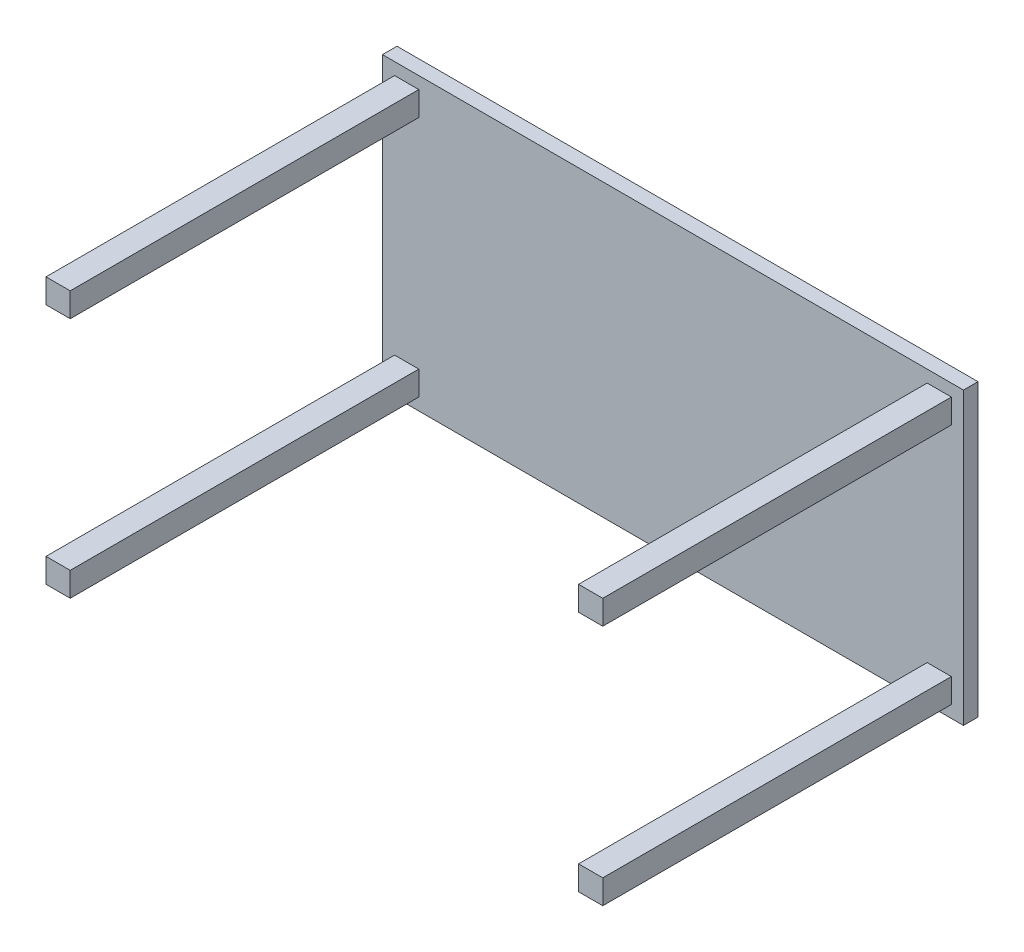
ISO-10303-21;
HEADER;
FILE_DESCRIPTION(('STEP AP214'),'2;1');
FILE_NAME('part.step','',(''),(''),'','','');
FILE_SCHEMA(('AUTOMOTIVE_DESIGN { 1 0 10303 214 1 1 1 1 }'));
ENDSEC;
DATA;
#1=APPLICATION_CONTEXT('core data for automotive mechanical design processes');
#2=APPLICATION_PROTOCOL_DEFINITION('international standard','automotive_design',2000,#1);
#3=PRODUCT_CONTEXT('',#1,'mechanical');
#4=PRODUCT('Part','Part','',(#3));
#5=PRODUCT_RELATED_PRODUCT_CATEGORY('part','',(#4));
#6=PRODUCT_DEFINITION_FORMATION('','',#4);
#7=PRODUCT_DEFINITION_CONTEXT('part definition',#1,'design');
#8=PRODUCT_DEFINITION('design','',#6,#7);
#9=PRODUCT_DEFINITION_SHAPE('','',#8);
#10=(LENGTH_UNIT() NAMED_UNIT(*) SI_UNIT(.MILLI.,.METRE.));
#11=(NAMED_UNIT(*) PLANE_ANGLE_UNIT() SI_UNIT($,.RADIAN.));
#12=(NAMED_UNIT(*) SI_UNIT($,.STERADIAN.) SOLID_ANGLE_UNIT());
#13=UNCERTAINTY_MEASURE_WITH_UNIT(LENGTH_MEASURE(1.E-05),#10,'distance_accuracy_value','');
#14=(GEOMETRIC_REPRESENTATION_CONTEXT(3) GLOBAL_UNCERTAINTY_ASSIGNED_CONTEXT((#13)) GLOBAL_UNIT_ASSIGNED_CONTEXT((#10,
#11,#12)) REPRESENTATION_CONTEXT('',''));
#15=CARTESIAN_POINT('',(0.,0.,0.));
#16=DIRECTION('',(0.,0.,1.));
#17=DIRECTION('',(1.,0.,0.));
#18=AXIS2_PLACEMENT_3D('',#15,#16,#17);
#19=CARTESIAN_POINT('',(0.,0.,30.));
#20=DIRECTION('',(0.,0.,-1.));
#21=DIRECTION('',(-1.,0.,0.));
#22=AXIS2_PLACEMENT_3D('',#19,#20,#21);
#23=PLANE('',#22);
#24=DIRECTION('',(0.,1.,0.));
#25=VECTOR('',#24,1.);
#26=CARTESIAN_POINT('',(-525.,0.,30.));
#27=LINE('',#26,#25);
#28=CARTESIAN_POINT('',(-525.,225.,30.));
#29=VERTEX_POINT('',#28);
#30=CARTESIAN_POINT('',(-525.,275.,30.));
#31=VERTEX_POINT('',#30);
#32=EDGE_CURVE('E239',#29,#31,#27,.T.);
#33=ORIENTED_EDGE('',*,*,#32,.F.);
#34=DIRECTION('',(1.,0.,0.));
#35=VECTOR('',#34,1.);
#36=CARTESIAN_POINT('',(0.,225.,30.));
#37=LINE('',#36,#35);
#38=CARTESIAN_POINT('',(-575.,225.,30.));
#39=VERTEX_POINT('',#38);
#40=EDGE_CURVE('E230',#39,#29,#37,.T.);
#41=ORIENTED_EDGE('',*,*,#40,.F.);
#42=DIRECTION('',(0.,-1.,0.));
#43=VECTOR('',#42,1.);
#44=CARTESIAN_POINT('',(-575.,0.,30.));
#45=LINE('',#44,#43);
#46=CARTESIAN_POINT('',(-575.,275.,30.));
#47=VERTEX_POINT('',#46);
#48=EDGE_CURVE('E233',#47,#39,#45,.T.);
#49=ORIENTED_EDGE('',*,*,#48,.F.);
#50=DIRECTION('',(-1.,0.,0.));
#51=VECTOR('',#50,1.);
#52=CARTESIAN_POINT('',(0.,275.,30.));
#53=LINE('',#52,#51);
#54=EDGE_CURVE('E236',#31,#47,#53,.T.);
#55=ORIENTED_EDGE('',*,*,#54,.F.);
#56=EDGE_LOOP('',(#33,#41,#49,#55));
#57=FACE_BOUND('',#56,.T.);
#58=DIRECTION('',(0.,1.,0.));
#59=VECTOR('',#58,1.);
#60=CARTESIAN_POINT('',(-525.,0.,30.));
#61=LINE('',#60,#59);
#62=CARTESIAN_POINT('',(-525.,-275.,30.));
#63=VERTEX_POINT('',#62);
#64=CARTESIAN_POINT('',(-525.,-225.,30.));
#65=VERTEX_POINT('',#64);
#66=EDGE_CURVE('E305',#63,#65,#61,.T.);
#67=ORIENTED_EDGE('',*,*,#66,.F.);
#68=DIRECTION('',(1.,0.,0.));
#69=VECTOR('',#68,1.);
#70=CARTESIAN_POINT('',(0.,-275.,30.));
#71=LINE('',#70,#69);
#72=CARTESIAN_POINT('',(-575.,-275.,30.));
#73=VERTEX_POINT('',#72);
#74=EDGE_CURVE('E296',#73,#63,#71,.T.);
#75=ORIENTED_EDGE('',*,*,#74,.F.);
#76=DIRECTION('',(0.,-1.,0.));
#77=VECTOR('',#76,1.);
#78=CARTESIAN_POINT('',(-575.,0.,30.));
#79=LINE('',#78,#77);
#80=CARTESIAN_POINT('',(-575.,-225.,30.));
#81=VERTEX_POINT('',#80);
#82=EDGE_CURVE('E299',#81,#73,#79,.T.);
#83=ORIENTED_EDGE('',*,*,#82,.F.);
#84=DIRECTION('',(-1.,0.,0.));
#85=VECTOR('',#84,1.);
#86=CARTESIAN_POINT('',(0.,-225.,30.));
#87=LINE('',#86,#85);
#88=EDGE_CURVE('E302',#65,#81,#87,.T.);
#89=ORIENTED_EDGE('',*,*,#88,.F.);
#90=EDGE_LOOP('',(#67,#75,#83,#89));
#91=FACE_BOUND('',#90,.T.);
#92=DIRECTION('',(0.,1.,0.));
#93=VECTOR('',#92,1.);
#94=CARTESIAN_POINT('',(600.,-300.,30.));
#95=LINE('',#94,#93);
#96=CARTESIAN_POINT('',(600.,-300.,30.));
#97=VERTEX_POINT('',#96);
#98=CARTESIAN_POINT('',(600.,300.,30.));
#99=VERTEX_POINT('',#98);
#100=EDGE_CURVE('E309',#97,#99,#95,.T.);
#101=ORIENTED_EDGE('',*,*,#100,.T.);
#102=DIRECTION('',(-1.,0.,0.));
#103=VECTOR('',#102,1.);
#104=CARTESIAN_POINT('',(-600.,300.,30.));
#105=LINE('',#104,#103);
#106=CARTESIAN_POINT('',(-600.,300.,30.));
#107=VERTEX_POINT('',#106);
#108=EDGE_CURVE('E312',#99,#107,#105,.T.);
#109=ORIENTED_EDGE('',*,*,#108,.T.);
#110=DIRECTION('',(0.,-1.,0.));
#111=VECTOR('',#110,1.);
#112=CARTESIAN_POINT('',(-600.,-300.,30.));
#113=LINE('',#112,#111);
#114=CARTESIAN_POINT('',(-600.,-300.,30.));
#115=VERTEX_POINT('',#114);
#116=EDGE_CURVE('E315',#107,#115,#113,.T.);
#117=ORIENTED_EDGE('',*,*,#116,.T.);
#118=DIRECTION('',(1.,0.,0.));
#119=VECTOR('',#118,1.);
#120=CARTESIAN_POINT('',(-600.,-300.,30.));
#121=LINE('',#120,#119);
#122=EDGE_CURVE('E317',#115,#97,#121,.T.);
#123=ORIENTED_EDGE('',*,*,#122,.T.);
#124=EDGE_LOOP('',(#101,#109,#117,#123));
#125=FACE_BOUND('',#124,.T.);
#126=DIRECTION('',(0.,1.,0.));
#127=VECTOR('',#126,1.);
#128=CARTESIAN_POINT('',(575.,0.,30.));
#129=LINE('',#128,#127);
#130=CARTESIAN_POINT('',(575.,-275.,30.));
#131=VERTEX_POINT('',#130);
#132=CARTESIAN_POINT('',(575.,-225.,30.));
#133=VERTEX_POINT('',#132);
#134=EDGE_CURVE('E272',#131,#133,#129,.T.);
#135=ORIENTED_EDGE('',*,*,#134,.F.);
#136=DIRECTION('',(1.,0.,0.));
#137=VECTOR('',#136,1.);
#138=CARTESIAN_POINT('',(0.,-275.,30.));
#139=LINE('',#138,#137);
#140=CARTESIAN_POINT('',(525.,-275.,30.));
#141=VERTEX_POINT('',#140);
#142=EDGE_CURVE('E263',#141,#131,#139,.T.);
#143=ORIENTED_EDGE('',*,*,#142,.F.);
#144=DIRECTION('',(0.,-1.,0.));
#145=VECTOR('',#144,1.);
#146=CARTESIAN_POINT('',(525.,0.,30.));
#147=LINE('',#146,#145);
#148=CARTESIAN_POINT('',(525.,-225.,30.));
#149=VERTEX_POINT('',#148);
#150=EDGE_CURVE('E266',#149,#141,#147,.T.);
#151=ORIENTED_EDGE('',*,*,#150,.F.);
#152=DIRECTION('',(-1.,0.,0.));
#153=VECTOR('',#152,1.);
#154=CARTESIAN_POINT('',(0.,-225.,30.));
#155=LINE('',#154,#153);
#156=EDGE_CURVE('E269',#133,#149,#155,.T.);
#157=ORIENTED_EDGE('',*,*,#156,.F.);
#158=EDGE_LOOP('',(#135,#143,#151,#157));
#159=FACE_BOUND('',#158,.T.);
#160=DIRECTION('',(0.,1.,0.));
#161=VECTOR('',#160,1.);
#162=CARTESIAN_POINT('',(575.,0.,30.));
#163=LINE('',#162,#161);
#164=CARTESIAN_POINT('',(575.,225.,30.));
#165=VERTEX_POINT('',#164);
#166=CARTESIAN_POINT('',(575.,275.,30.));
#167=VERTEX_POINT('',#166);
#168=EDGE_CURVE('E197',#165,#167,#163,.T.);
#169=ORIENTED_EDGE('',*,*,#168,.F.);
#170=DIRECTION('',(1.,0.,0.));
#171=VECTOR('',#170,1.);
#172=CARTESIAN_POINT('',(0.,225.,30.));
#173=LINE('',#172,#171);
#174=CARTESIAN_POINT('',(525.,225.,30.));
#175=VERTEX_POINT('',#174);
#176=EDGE_CURVE('E198',#175,#165,#173,.T.);
#177=ORIENTED_EDGE('',*,*,#176,.F.);
#178=DIRECTION('',(0.,-1.,0.));
#179=VECTOR('',#178,1.);
#180=CARTESIAN_POINT('',(525.,0.,30.));
#181=LINE('',#180,#179);
#182=CARTESIAN_POINT('',(525.,275.,30.));
#183=VERTEX_POINT('',#182);
#184=EDGE_CURVE('E61',#183,#175,#181,.T.);
#185=ORIENTED_EDGE('',*,*,#184,.F.);
#186=DIRECTION('',(-1.,0.,0.));
#187=VECTOR('',#186,1.);
#188=CARTESIAN_POINT('',(0.,275.,30.));
#189=LINE('',#188,#187);
#190=EDGE_CURVE('E56',#167,#183,#189,.T.);
#191=ORIENTED_EDGE('',*,*,#190,.F.);
#192=EDGE_LOOP('',(#169,#177,#185,#191));
#193=FACE_BOUND('',#192,.T.);
#194=ADVANCED_FACE('F41',(#57,#91,#125,#159,#193),#23,.F.);
#195=CARTESIAN_POINT('',(600.,-300.,30.));
#196=DIRECTION('',(-1.,0.,0.));
#197=DIRECTION('',(0.,0.,1.));
#198=AXIS2_PLACEMENT_3D('',#195,#196,#197);
#199=PLANE('',#198);
#200=DIRECTION('',(0.,1.,0.));
#201=VECTOR('',#200,1.);
#202=CARTESIAN_POINT('',(600.,-300.,0.));
#203=LINE('',#202,#201);
#204=CARTESIAN_POINT('',(600.,-300.,0.));
#205=VERTEX_POINT('',#204);
#206=CARTESIAN_POINT('',(600.,300.,0.));
#207=VERTEX_POINT('',#206);
#208=EDGE_CURVE('E308',#205,#207,#203,.T.);
#209=ORIENTED_EDGE('',*,*,#208,.T.);
#210=DIRECTION('',(0.,0.,-1.));
#211=VECTOR('',#210,1.);
#212=CARTESIAN_POINT('',(600.,300.,30.));
#213=LINE('',#212,#211);
#214=EDGE_CURVE('E11',#99,#207,#213,.T.);
#215=ORIENTED_EDGE('',*,*,#214,.F.);
#216=ORIENTED_EDGE('',*,*,#100,.F.);
#217=DIRECTION('',(0.,0.,-1.));
#218=VECTOR('',#217,1.);
#219=CARTESIAN_POINT('',(600.,-300.,30.));
#220=LINE('',#219,#218);
#221=EDGE_CURVE('E319',#97,#205,#220,.T.);
#222=ORIENTED_EDGE('',*,*,#221,.T.);
#223=EDGE_LOOP('',(#209,#215,#216,#222));
#224=FACE_BOUND('',#223,.T.);
#225=ADVANCED_FACE('F43',(#224),#199,.F.);
#226=CARTESIAN_POINT('',(-600.,300.,30.));
#227=DIRECTION('',(0.,-1.,0.));
#228=DIRECTION('',(0.,0.,-1.));
#229=AXIS2_PLACEMENT_3D('',#226,#227,#228);
#230=PLANE('',#229);
#231=DIRECTION('',(-1.,0.,0.));
#232=VECTOR('',#231,1.);
#233=CARTESIAN_POINT('',(-600.,300.,0.));
#234=LINE('',#233,#232);
#235=CARTESIAN_POINT('',(-600.,300.,0.));
#236=VERTEX_POINT('',#235);
#237=EDGE_CURVE('E322',#207,#236,#234,.T.);
#238=ORIENTED_EDGE('',*,*,#237,.T.);
#239=DIRECTION('',(0.,0.,-1.));
#240=VECTOR('',#239,1.);
#241=CARTESIAN_POINT('',(-600.,300.,30.));
#242=LINE('',#241,#240);
#243=EDGE_CURVE('E49',#107,#236,#242,.T.);
#244=ORIENTED_EDGE('',*,*,#243,.F.);
#245=ORIENTED_EDGE('',*,*,#108,.F.);
#246=ORIENTED_EDGE('',*,*,#214,.T.);
#247=EDGE_LOOP('',(#238,#244,#245,#246));
#248=FACE_BOUND('',#247,.T.);
#249=ADVANCED_FACE('F352',(#248),#230,.F.);
#250=CARTESIAN_POINT('',(-600.,-300.,30.));
#251=DIRECTION('',(1.,0.,0.));
#252=DIRECTION('',(0.,0.,-1.));
#253=AXIS2_PLACEMENT_3D('',#250,#251,#252);
#254=PLANE('',#253);
#255=DIRECTION('',(0.,-1.,0.));
#256=VECTOR('',#255,1.);
#257=CARTESIAN_POINT('',(-600.,-300.,0.));
#258=LINE('',#257,#256);
#259=CARTESIAN_POINT('',(-600.,-300.,0.));
#260=VERTEX_POINT('',#259);
#261=EDGE_CURVE('E324',#236,#260,#258,.T.);
#262=ORIENTED_EDGE('',*,*,#261,.T.);
#263=DIRECTION('',(0.,0.,-1.));
#264=VECTOR('',#263,1.);
#265=CARTESIAN_POINT('',(-600.,-300.,30.));
#266=LINE('',#265,#264);
#267=EDGE_CURVE('E329',#115,#260,#266,.T.);
#268=ORIENTED_EDGE('',*,*,#267,.F.);
#269=ORIENTED_EDGE('',*,*,#116,.F.);
#270=ORIENTED_EDGE('',*,*,#243,.T.);
#271=EDGE_LOOP('',(#262,#268,#269,#270));
#272=FACE_BOUND('',#271,.T.);
#273=ADVANCED_FACE('F336',(#272),#254,.F.);
#274=CARTESIAN_POINT('',(-600.,-300.,30.));
#275=DIRECTION('',(0.,1.,0.));
#276=DIRECTION('',(0.,0.,1.));
#277=AXIS2_PLACEMENT_3D('',#274,#275,#276);
#278=PLANE('',#277);
#279=DIRECTION('',(1.,0.,0.));
#280=VECTOR('',#279,1.);
#281=CARTESIAN_POINT('',(-600.,-300.,0.));
#282=LINE('',#281,#280);
#283=EDGE_CURVE('E313',#260,#205,#282,.T.);
#284=ORIENTED_EDGE('',*,*,#283,.T.);
#285=ORIENTED_EDGE('',*,*,#221,.F.);
#286=ORIENTED_EDGE('',*,*,#122,.F.);
#287=ORIENTED_EDGE('',*,*,#267,.T.);
#288=EDGE_LOOP('',(#284,#285,#286,#287));
#289=FACE_BOUND('',#288,.T.);
#290=ADVANCED_FACE('F345',(#289),#278,.F.);
#291=CARTESIAN_POINT('',(0.,0.,0.));
#292=DIRECTION('',(0.,0.,-1.));
#293=DIRECTION('',(-1.,0.,0.));
#294=AXIS2_PLACEMENT_3D('',#291,#292,#293);
#295=PLANE('',#294);
#296=ORIENTED_EDGE('',*,*,#208,.F.);
#297=ORIENTED_EDGE('',*,*,#283,.F.);
#298=ORIENTED_EDGE('',*,*,#261,.F.);
#299=ORIENTED_EDGE('',*,*,#237,.F.);
#300=EDGE_LOOP('',(#296,#297,#298,#299));
#301=FACE_BOUND('',#300,.T.);
#302=ADVANCED_FACE('F342',(#301),#295,.T.);
#303=CARTESIAN_POINT('',(-525.,-275.,750.));
#304=DIRECTION('',(-1.,0.,0.));
#305=DIRECTION('',(0.,0.,1.));
#306=AXIS2_PLACEMENT_3D('',#303,#304,#305);
#307=PLANE('',#306);
#308=DIRECTION('',(0.,0.,-1.));
#309=VECTOR('',#308,1.);
#310=CARTESIAN_POINT('',(-525.,-275.,750.));
#311=LINE('',#310,#309);
#312=CARTESIAN_POINT('',(-525.,-275.,750.));
#313=VERTEX_POINT('',#312);
#314=EDGE_CURVE('E284',#313,#63,#311,.T.);
#315=ORIENTED_EDGE('',*,*,#314,.T.);
#316=ORIENTED_EDGE('',*,*,#66,.T.);
#317=DIRECTION('',(0.,0.,-1.));
#318=VECTOR('',#317,1.);
#319=CARTESIAN_POINT('',(-525.,-225.,750.));
#320=LINE('',#319,#318);
#321=CARTESIAN_POINT('',(-525.,-225.,750.));
#322=VERTEX_POINT('',#321);
#323=EDGE_CURVE('E293',#322,#65,#320,.T.);
#324=ORIENTED_EDGE('',*,*,#323,.F.);
#325=DIRECTION('',(0.,1.,0.));
#326=VECTOR('',#325,1.);
#327=CARTESIAN_POINT('',(-525.,-275.,750.));
#328=LINE('',#327,#326);
#329=EDGE_CURVE('E275',#313,#322,#328,.T.);
#330=ORIENTED_EDGE('',*,*,#329,.F.);
#331=EDGE_LOOP('',(#315,#316,#324,#330));
#332=FACE_BOUND('',#331,.T.);
#333=ADVANCED_FACE('F369',(#332),#307,.F.);
#334=CARTESIAN_POINT('',(-575.,-225.,750.));
#335=DIRECTION('',(0.,-1.,0.));
#336=DIRECTION('',(0.,0.,-1.));
#337=AXIS2_PLACEMENT_3D('',#334,#335,#336);
#338=PLANE('',#337);
#339=ORIENTED_EDGE('',*,*,#323,.T.);
#340=ORIENTED_EDGE('',*,*,#88,.T.);
#341=DIRECTION('',(0.,0.,-1.));
#342=VECTOR('',#341,1.);
#343=CARTESIAN_POINT('',(-575.,-225.,750.));
#344=LINE('',#343,#342);
#345=CARTESIAN_POINT('',(-575.,-225.,750.));
#346=VERTEX_POINT('',#345);
#347=EDGE_CURVE('E290',#346,#81,#344,.T.);
#348=ORIENTED_EDGE('',*,*,#347,.F.);
#349=DIRECTION('',(-1.,0.,0.));
#350=VECTOR('',#349,1.);
#351=CARTESIAN_POINT('',(-575.,-225.,750.));
#352=LINE('',#351,#350);
#353=EDGE_CURVE('E278',#322,#346,#352,.T.);
#354=ORIENTED_EDGE('',*,*,#353,.F.);
#355=EDGE_LOOP('',(#339,#340,#348,#354));
#356=FACE_BOUND('',#355,.T.);
#357=ADVANCED_FACE('F385',(#356),#338,.F.);
#358=CARTESIAN_POINT('',(-575.,-275.,750.));
#359=DIRECTION('',(1.,0.,0.));
#360=DIRECTION('',(0.,0.,-1.));
#361=AXIS2_PLACEMENT_3D('',#358,#359,#360);
#362=PLANE('',#361);
#363=ORIENTED_EDGE('',*,*,#347,.T.);
#364=ORIENTED_EDGE('',*,*,#82,.T.);
#365=DIRECTION('',(0.,0.,-1.));
#366=VECTOR('',#365,1.);
#367=CARTESIAN_POINT('',(-575.,-275.,750.));
#368=LINE('',#367,#366);
#369=CARTESIAN_POINT('',(-575.,-275.,750.));
#370=VERTEX_POINT('',#369);
#371=EDGE_CURVE('E287',#370,#73,#368,.T.);
#372=ORIENTED_EDGE('',*,*,#371,.F.);
#373=DIRECTION('',(0.,-1.,0.));
#374=VECTOR('',#373,1.);
#375=CARTESIAN_POINT('',(-575.,-275.,750.));
#376=LINE('',#375,#374);
#377=EDGE_CURVE('E280',#346,#370,#376,.T.);
#378=ORIENTED_EDGE('',*,*,#377,.F.);
#379=EDGE_LOOP('',(#363,#364,#372,#378));
#380=FACE_BOUND('',#379,.T.);
#381=ADVANCED_FACE('F393',(#380),#362,.F.);
#382=CARTESIAN_POINT('',(-575.,-275.,750.));
#383=DIRECTION('',(0.,1.,0.));
#384=DIRECTION('',(0.,0.,1.));
#385=AXIS2_PLACEMENT_3D('',#382,#383,#384);
#386=PLANE('',#385);
#387=ORIENTED_EDGE('',*,*,#371,.T.);
#388=ORIENTED_EDGE('',*,*,#74,.T.);
#389=ORIENTED_EDGE('',*,*,#314,.F.);
#390=DIRECTION('',(1.,0.,0.));
#391=VECTOR('',#390,1.);
#392=CARTESIAN_POINT('',(-575.,-275.,750.));
#393=LINE('',#392,#391);
#394=EDGE_CURVE('E282',#370,#313,#393,.T.);
#395=ORIENTED_EDGE('',*,*,#394,.F.);
#396=EDGE_LOOP('',(#387,#388,#389,#395));
#397=FACE_BOUND('',#396,.T.);
#398=ADVANCED_FACE('F401',(#397),#386,.F.);
#399=CARTESIAN_POINT('',(0.,0.,750.));
#400=DIRECTION('',(0.,0.,-1.));
#401=DIRECTION('',(-1.,0.,0.));
#402=AXIS2_PLACEMENT_3D('',#399,#400,#401);
#403=PLANE('',#402);
#404=ORIENTED_EDGE('',*,*,#329,.T.);
#405=ORIENTED_EDGE('',*,*,#353,.T.);
#406=ORIENTED_EDGE('',*,*,#377,.T.);
#407=ORIENTED_EDGE('',*,*,#394,.T.);
#408=EDGE_LOOP('',(#404,#405,#406,#407));
#409=FACE_BOUND('',#408,.T.);
#410=ADVANCED_FACE('F410',(#409),#403,.F.);
#411=CARTESIAN_POINT('',(575.,-275.,750.));
#412=DIRECTION('',(-1.,0.,0.));
#413=DIRECTION('',(0.,0.,1.));
#414=AXIS2_PLACEMENT_3D('',#411,#412,#413);
#415=PLANE('',#414);
#416=DIRECTION('',(0.,0.,-1.));
#417=VECTOR('',#416,1.);
#418=CARTESIAN_POINT('',(575.,-275.,750.));
#419=LINE('',#418,#417);
#420=CARTESIAN_POINT('',(575.,-275.,750.));
#421=VERTEX_POINT('',#420);
#422=EDGE_CURVE('E251',#421,#131,#419,.T.);
#423=ORIENTED_EDGE('',*,*,#422,.T.);
#424=ORIENTED_EDGE('',*,*,#134,.T.);
#425=DIRECTION('',(0.,0.,-1.));
#426=VECTOR('',#425,1.);
#427=CARTESIAN_POINT('',(575.,-225.,750.));
#428=LINE('',#427,#426);
#429=CARTESIAN_POINT('',(575.,-225.,750.));
#430=VERTEX_POINT('',#429);
#431=EDGE_CURVE('E260',#430,#133,#428,.T.);
#432=ORIENTED_EDGE('',*,*,#431,.F.);
#433=DIRECTION('',(0.,1.,0.));
#434=VECTOR('',#433,1.);
#435=CARTESIAN_POINT('',(575.,-275.,750.));
#436=LINE('',#435,#434);
#437=EDGE_CURVE('E242',#421,#430,#436,.T.);
#438=ORIENTED_EDGE('',*,*,#437,.F.);
#439=EDGE_LOOP('',(#423,#424,#432,#438));
#440=FACE_BOUND('',#439,.T.);
#441=ADVANCED_FACE('F419',(#440),#415,.F.);
#442=CARTESIAN_POINT('',(525.,-225.,750.));
#443=DIRECTION('',(0.,-1.,0.));
#444=DIRECTION('',(0.,0.,-1.));
#445=AXIS2_PLACEMENT_3D('',#442,#443,#444);
#446=PLANE('',#445);
#447=ORIENTED_EDGE('',*,*,#431,.T.);
#448=ORIENTED_EDGE('',*,*,#156,.T.);
#449=DIRECTION('',(0.,0.,-1.));
#450=VECTOR('',#449,1.);
#451=CARTESIAN_POINT('',(525.,-225.,750.));
#452=LINE('',#451,#450);
#453=CARTESIAN_POINT('',(525.,-225.,750.));
#454=VERTEX_POINT('',#453);
#455=EDGE_CURVE('E257',#454,#149,#452,.T.);
#456=ORIENTED_EDGE('',*,*,#455,.F.);
#457=DIRECTION('',(-1.,0.,0.));
#458=VECTOR('',#457,1.);
#459=CARTESIAN_POINT('',(525.,-225.,750.));
#460=LINE('',#459,#458);
#461=EDGE_CURVE('E245',#430,#454,#460,.T.);
#462=ORIENTED_EDGE('',*,*,#461,.F.);
#463=EDGE_LOOP('',(#447,#448,#456,#462));
#464=FACE_BOUND('',#463,.T.);
#465=ADVANCED_FACE('F428',(#464),#446,.F.);
#466=CARTESIAN_POINT('',(525.,-275.,750.));
#467=DIRECTION('',(1.,0.,0.));
#468=DIRECTION('',(0.,0.,-1.));
#469=AXIS2_PLACEMENT_3D('',#466,#467,#468);
#470=PLANE('',#469);
#471=ORIENTED_EDGE('',*,*,#455,.T.);
#472=ORIENTED_EDGE('',*,*,#150,.T.);
#473=DIRECTION('',(0.,0.,-1.));
#474=VECTOR('',#473,1.);
#475=CARTESIAN_POINT('',(525.,-275.,750.));
#476=LINE('',#475,#474);
#477=CARTESIAN_POINT('',(525.,-275.,750.));
#478=VERTEX_POINT('',#477);
#479=EDGE_CURVE('E254',#478,#141,#476,.T.);
#480=ORIENTED_EDGE('',*,*,#479,.F.);
#481=DIRECTION('',(0.,-1.,0.));
#482=VECTOR('',#481,1.);
#483=CARTESIAN_POINT('',(525.,-275.,750.));
#484=LINE('',#483,#482);
#485=EDGE_CURVE('E247',#454,#478,#484,.T.);
#486=ORIENTED_EDGE('',*,*,#485,.F.);
#487=EDGE_LOOP('',(#471,#472,#480,#486));
#488=FACE_BOUND('',#487,.T.);
#489=ADVANCED_FACE('F437',(#488),#470,.F.);
#490=CARTESIAN_POINT('',(525.,-275.,750.));
#491=DIRECTION('',(0.,1.,0.));
#492=DIRECTION('',(0.,0.,1.));
#493=AXIS2_PLACEMENT_3D('',#490,#491,#492);
#494=PLANE('',#493);
#495=ORIENTED_EDGE('',*,*,#479,.T.);
#496=ORIENTED_EDGE('',*,*,#142,.T.);
#497=ORIENTED_EDGE('',*,*,#422,.F.);
#498=DIRECTION('',(1.,0.,0.));
#499=VECTOR('',#498,1.);
#500=CARTESIAN_POINT('',(525.,-275.,750.));
#501=LINE('',#500,#499);
#502=EDGE_CURVE('E249',#478,#421,#501,.T.);
#503=ORIENTED_EDGE('',*,*,#502,.F.);
#504=EDGE_LOOP('',(#495,#496,#497,#503));
#505=FACE_BOUND('',#504,.T.);
#506=ADVANCED_FACE('F446',(#505),#494,.F.);
#507=CARTESIAN_POINT('',(0.,0.,750.));
#508=DIRECTION('',(0.,0.,-1.));
#509=DIRECTION('',(-1.,0.,0.));
#510=AXIS2_PLACEMENT_3D('',#507,#508,#509);
#511=PLANE('',#510);
#512=ORIENTED_EDGE('',*,*,#437,.T.);
#513=ORIENTED_EDGE('',*,*,#461,.T.);
#514=ORIENTED_EDGE('',*,*,#485,.T.);
#515=ORIENTED_EDGE('',*,*,#502,.T.);
#516=EDGE_LOOP('',(#512,#513,#514,#515));
#517=FACE_BOUND('',#516,.T.);
#518=ADVANCED_FACE('F455',(#517),#511,.F.);
#519=CARTESIAN_POINT('',(-525.,225.,750.));
#520=DIRECTION('',(-1.,0.,0.));
#521=DIRECTION('',(0.,0.,1.));
#522=AXIS2_PLACEMENT_3D('',#519,#520,#521);
#523=PLANE('',#522);
#524=DIRECTION('',(0.,0.,-1.));
#525=VECTOR('',#524,1.);
#526=CARTESIAN_POINT('',(-525.,225.,750.));
#527=LINE('',#526,#525);
#528=CARTESIAN_POINT('',(-525.,225.,750.));
#529=VERTEX_POINT('',#528);
#530=EDGE_CURVE('E218',#529,#29,#527,.T.);
#531=ORIENTED_EDGE('',*,*,#530,.T.);
#532=ORIENTED_EDGE('',*,*,#32,.T.);
#533=DIRECTION('',(0.,0.,-1.));
#534=VECTOR('',#533,1.);
#535=CARTESIAN_POINT('',(-525.,275.,750.));
#536=LINE('',#535,#534);
#537=CARTESIAN_POINT('',(-525.,275.,750.));
#538=VERTEX_POINT('',#537);
#539=EDGE_CURVE('E227',#538,#31,#536,.T.);
#540=ORIENTED_EDGE('',*,*,#539,.F.);
#541=DIRECTION('',(0.,1.,0.));
#542=VECTOR('',#541,1.);
#543=CARTESIAN_POINT('',(-525.,225.,750.));
#544=LINE('',#543,#542);
#545=EDGE_CURVE('E209',#529,#538,#544,.T.);
#546=ORIENTED_EDGE('',*,*,#545,.F.);
#547=EDGE_LOOP('',(#531,#532,#540,#546));
#548=FACE_BOUND('',#547,.T.);
#549=ADVANCED_FACE('F464',(#548),#523,.F.);
#550=CARTESIAN_POINT('',(-575.,275.,750.));
#551=DIRECTION('',(0.,-1.,0.));
#552=DIRECTION('',(0.,0.,-1.));
#553=AXIS2_PLACEMENT_3D('',#550,#551,#552);
#554=PLANE('',#553);
#555=ORIENTED_EDGE('',*,*,#539,.T.);
#556=ORIENTED_EDGE('',*,*,#54,.T.);
#557=DIRECTION('',(0.,0.,-1.));
#558=VECTOR('',#557,1.);
#559=CARTESIAN_POINT('',(-575.,275.,750.));
#560=LINE('',#559,#558);
#561=CARTESIAN_POINT('',(-575.,275.,750.));
#562=VERTEX_POINT('',#561);
#563=EDGE_CURVE('E224',#562,#47,#560,.T.);
#564=ORIENTED_EDGE('',*,*,#563,.F.);
#565=DIRECTION('',(-1.,0.,0.));
#566=VECTOR('',#565,1.);
#567=CARTESIAN_POINT('',(-575.,275.,750.));
#568=LINE('',#567,#566);
#569=EDGE_CURVE('E212',#538,#562,#568,.T.);
#570=ORIENTED_EDGE('',*,*,#569,.F.);
#571=EDGE_LOOP('',(#555,#556,#564,#570));
#572=FACE_BOUND('',#571,.T.);
#573=ADVANCED_FACE('F473',(#572),#554,.F.);
#574=CARTESIAN_POINT('',(-575.,225.,750.));
#575=DIRECTION('',(1.,0.,0.));
#576=DIRECTION('',(0.,0.,-1.));
#577=AXIS2_PLACEMENT_3D('',#574,#575,#576);
#578=PLANE('',#577);
#579=ORIENTED_EDGE('',*,*,#563,.T.);
#580=ORIENTED_EDGE('',*,*,#48,.T.);
#581=DIRECTION('',(0.,0.,-1.));
#582=VECTOR('',#581,1.);
#583=CARTESIAN_POINT('',(-575.,225.,750.));
#584=LINE('',#583,#582);
#585=CARTESIAN_POINT('',(-575.,225.,750.));
#586=VERTEX_POINT('',#585);
#587=EDGE_CURVE('E221',#586,#39,#584,.T.);
#588=ORIENTED_EDGE('',*,*,#587,.F.);
#589=DIRECTION('',(0.,-1.,0.));
#590=VECTOR('',#589,1.);
#591=CARTESIAN_POINT('',(-575.,225.,750.));
#592=LINE('',#591,#590);
#593=EDGE_CURVE('E214',#562,#586,#592,.T.);
#594=ORIENTED_EDGE('',*,*,#593,.F.);
#595=EDGE_LOOP('',(#579,#580,#588,#594));
#596=FACE_BOUND('',#595,.T.);
#597=ADVANCED_FACE('F482',(#596),#578,.F.);
#598=CARTESIAN_POINT('',(-575.,225.,750.));
#599=DIRECTION('',(0.,1.,0.));
#600=DIRECTION('',(0.,0.,1.));
#601=AXIS2_PLACEMENT_3D('',#598,#599,#600);
#602=PLANE('',#601);
#603=ORIENTED_EDGE('',*,*,#587,.T.);
#604=ORIENTED_EDGE('',*,*,#40,.T.);
#605=ORIENTED_EDGE('',*,*,#530,.F.);
#606=DIRECTION('',(1.,0.,0.));
#607=VECTOR('',#606,1.);
#608=CARTESIAN_POINT('',(-575.,225.,750.));
#609=LINE('',#608,#607);
#610=EDGE_CURVE('E216',#586,#529,#609,.T.);
#611=ORIENTED_EDGE('',*,*,#610,.F.);
#612=EDGE_LOOP('',(#603,#604,#605,#611));
#613=FACE_BOUND('',#612,.T.);
#614=ADVANCED_FACE('F491',(#613),#602,.F.);
#615=CARTESIAN_POINT('',(0.,0.,750.));
#616=DIRECTION('',(0.,0.,-1.));
#617=DIRECTION('',(-1.,0.,0.));
#618=AXIS2_PLACEMENT_3D('',#615,#616,#617);
#619=PLANE('',#618);
#620=ORIENTED_EDGE('',*,*,#545,.T.);
#621=ORIENTED_EDGE('',*,*,#569,.T.);
#622=ORIENTED_EDGE('',*,*,#593,.T.);
#623=ORIENTED_EDGE('',*,*,#610,.T.);
#624=EDGE_LOOP('',(#620,#621,#622,#623));
#625=FACE_BOUND('',#624,.T.);
#626=ADVANCED_FACE('F499',(#625),#619,.F.);
#627=CARTESIAN_POINT('',(575.,225.,750.));
#628=DIRECTION('',(-1.,0.,0.));
#629=DIRECTION('',(0.,0.,1.));
#630=AXIS2_PLACEMENT_3D('',#627,#628,#629);
#631=PLANE('',#630);
#632=DIRECTION('',(0.,0.,-1.));
#633=VECTOR('',#632,1.);
#634=CARTESIAN_POINT('',(575.,225.,750.));
#635=LINE('',#634,#633);
#636=CARTESIAN_POINT('',(575.,225.,750.));
#637=VERTEX_POINT('',#636);
#638=EDGE_CURVE('E563',#637,#165,#635,.T.);
#639=ORIENTED_EDGE('',*,*,#638,.T.);
#640=ORIENTED_EDGE('',*,*,#168,.T.);
#641=DIRECTION('',(0.,0.,-1.));
#642=VECTOR('',#641,1.);
#643=CARTESIAN_POINT('',(575.,275.,750.));
#644=LINE('',#643,#642);
#645=CARTESIAN_POINT('',(575.,275.,750.));
#646=VERTEX_POINT('',#645);
#647=EDGE_CURVE('E180',#646,#167,#644,.T.);
#648=ORIENTED_EDGE('',*,*,#647,.F.);
#649=DIRECTION('',(0.,1.,0.));
#650=VECTOR('',#649,1.);
#651=CARTESIAN_POINT('',(575.,225.,750.));
#652=LINE('',#651,#650);
#653=EDGE_CURVE('E186',#637,#646,#652,.T.);
#654=ORIENTED_EDGE('',*,*,#653,.F.);
#655=EDGE_LOOP('',(#639,#640,#648,#654));
#656=FACE_BOUND('',#655,.T.);
#657=ADVANCED_FACE('F196',(#656),#631,.F.);
#658=CARTESIAN_POINT('',(525.,275.,750.));
#659=DIRECTION('',(0.,-1.,0.));
#660=DIRECTION('',(0.,0.,-1.));
#661=AXIS2_PLACEMENT_3D('',#658,#659,#660);
#662=PLANE('',#661);
#663=ORIENTED_EDGE('',*,*,#647,.T.);
#664=ORIENTED_EDGE('',*,*,#190,.T.);
#665=DIRECTION('',(0.,0.,-1.));
#666=VECTOR('',#665,1.);
#667=CARTESIAN_POINT('',(525.,275.,750.));
#668=LINE('',#667,#666);
#669=CARTESIAN_POINT('',(525.,275.,750.));
#670=VERTEX_POINT('',#669);
#671=EDGE_CURVE('E182',#670,#183,#668,.T.);
#672=ORIENTED_EDGE('',*,*,#671,.F.);
#673=DIRECTION('',(-1.,0.,0.));
#674=VECTOR('',#673,1.);
#675=CARTESIAN_POINT('',(525.,275.,750.));
#676=LINE('',#675,#674);
#677=EDGE_CURVE('E176',#646,#670,#676,.T.);
#678=ORIENTED_EDGE('',*,*,#677,.F.);
#679=EDGE_LOOP('',(#663,#664,#672,#678));
#680=FACE_BOUND('',#679,.T.);
#681=ADVANCED_FACE('F178',(#680),#662,.F.);
#682=CARTESIAN_POINT('',(525.,225.,750.));
#683=DIRECTION('',(1.,0.,0.));
#684=DIRECTION('',(0.,0.,-1.));
#685=AXIS2_PLACEMENT_3D('',#682,#683,#684);
#686=PLANE('',#685);
#687=ORIENTED_EDGE('',*,*,#671,.T.);
#688=ORIENTED_EDGE('',*,*,#184,.T.);
#689=DIRECTION('',(0.,0.,-1.));
#690=VECTOR('',#689,1.);
#691=CARTESIAN_POINT('',(525.,225.,750.));
#692=LINE('',#691,#690);
#693=CARTESIAN_POINT('',(525.,225.,750.));
#694=VERTEX_POINT('',#693);
#695=EDGE_CURVE('E202',#694,#175,#692,.T.);
#696=ORIENTED_EDGE('',*,*,#695,.F.);
#697=DIRECTION('',(0.,-1.,0.));
#698=VECTOR('',#697,1.);
#699=CARTESIAN_POINT('',(525.,225.,750.));
#700=LINE('',#699,#698);
#701=EDGE_CURVE('E185',#670,#694,#700,.T.);
#702=ORIENTED_EDGE('',*,*,#701,.F.);
#703=EDGE_LOOP('',(#687,#688,#696,#702));
#704=FACE_BOUND('',#703,.T.);
#705=ADVANCED_FACE('F531',(#704),#686,.F.);
#706=CARTESIAN_POINT('',(525.,225.,750.));
#707=DIRECTION('',(0.,1.,0.));
#708=DIRECTION('',(0.,0.,1.));
#709=AXIS2_PLACEMENT_3D('',#706,#707,#708);
#710=PLANE('',#709);
#711=ORIENTED_EDGE('',*,*,#695,.T.);
#712=ORIENTED_EDGE('',*,*,#176,.T.);
#713=ORIENTED_EDGE('',*,*,#638,.F.);
#714=DIRECTION('',(1.,0.,0.));
#715=VECTOR('',#714,1.);
#716=CARTESIAN_POINT('',(525.,225.,750.));
#717=LINE('',#716,#715);
#718=EDGE_CURVE('E191',#694,#637,#717,.T.);
#719=ORIENTED_EDGE('',*,*,#718,.F.);
#720=EDGE_LOOP('',(#711,#712,#713,#719));
#721=FACE_BOUND('',#720,.T.);
#722=ADVANCED_FACE('F540',(#721),#710,.F.);
#723=CARTESIAN_POINT('',(0.,0.,750.));
#724=DIRECTION('',(0.,0.,-1.));
#725=DIRECTION('',(-1.,0.,0.));
#726=AXIS2_PLACEMENT_3D('',#723,#724,#725);
#727=PLANE('',#726);
#728=ORIENTED_EDGE('',*,*,#653,.T.);
#729=ORIENTED_EDGE('',*,*,#677,.T.);
#730=ORIENTED_EDGE('',*,*,#701,.T.);
#731=ORIENTED_EDGE('',*,*,#718,.T.);
#732=EDGE_LOOP('',(#728,#729,#730,#731));
#733=FACE_BOUND('',#732,.T.);
#734=ADVANCED_FACE('F189',(#733),#727,.F.);
#735=CLOSED_SHELL('',(#194,#225,#249,#273,#290,#302,#333,#357,#381,#398,#410,#441,#465,#489,
#506,#518,#549,#573,#597,#614,#626,#657,#681,#705,#722,#734));
#736=MANIFOLD_SOLID_BREP('B2',#735);
#737=ADVANCED_BREP_SHAPE_REPRESENTATION('',(#18,#736),#14);
#738=SHAPE_DEFINITION_REPRESENTATION(#9,#737);
ENDSEC;
END-ISO-10303-21;
